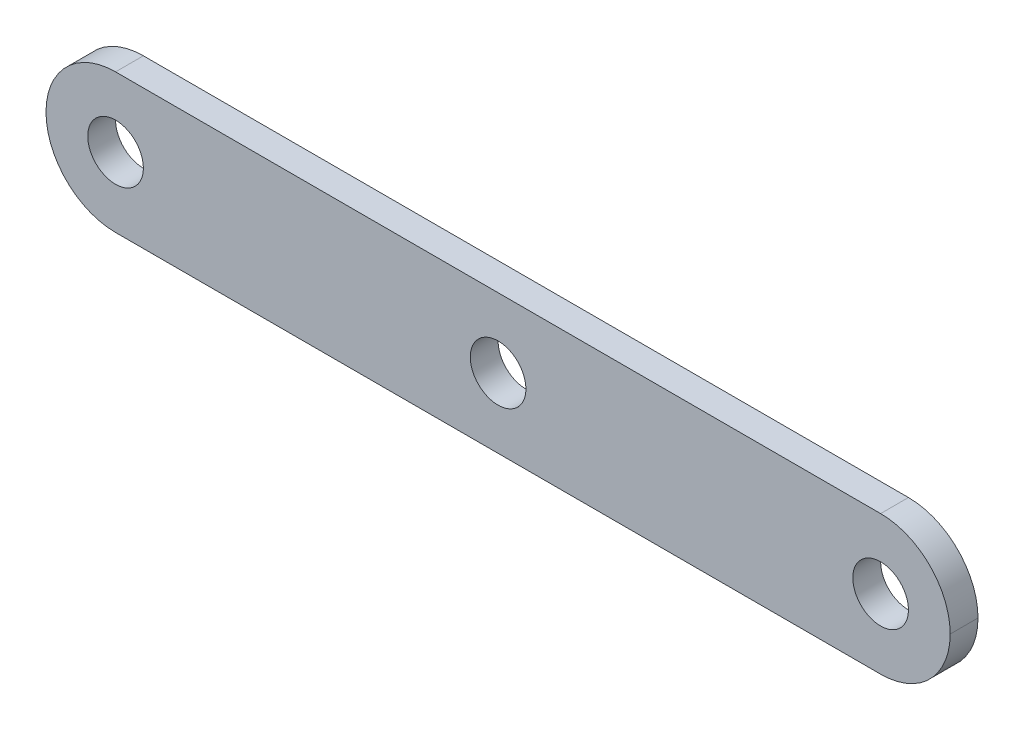
ISO-10303-21;
HEADER;
FILE_DESCRIPTION(('STEP AP214'),'2;1');
FILE_NAME('part.step','',(''),(''),'','','');
FILE_SCHEMA(('AUTOMOTIVE_DESIGN { 1 0 10303 214 1 1 1 1 }'));
ENDSEC;
DATA;
#1=APPLICATION_CONTEXT('core data for automotive mechanical design processes');
#2=APPLICATION_PROTOCOL_DEFINITION('international standard','automotive_design',2000,#1);
#3=PRODUCT_CONTEXT('',#1,'mechanical');
#4=PRODUCT('Part','Part','',(#3));
#5=PRODUCT_RELATED_PRODUCT_CATEGORY('part','',(#4));
#6=PRODUCT_DEFINITION_FORMATION('','',#4);
#7=PRODUCT_DEFINITION_CONTEXT('part definition',#1,'design');
#8=PRODUCT_DEFINITION('design','',#6,#7);
#9=PRODUCT_DEFINITION_SHAPE('','',#8);
#10=(LENGTH_UNIT() NAMED_UNIT(*) SI_UNIT(.MILLI.,.METRE.));
#11=(NAMED_UNIT(*) PLANE_ANGLE_UNIT() SI_UNIT($,.RADIAN.));
#12=(NAMED_UNIT(*) SI_UNIT($,.STERADIAN.) SOLID_ANGLE_UNIT());
#13=UNCERTAINTY_MEASURE_WITH_UNIT(LENGTH_MEASURE(1.E-05),#10,'distance_accuracy_value','');
#14=(GEOMETRIC_REPRESENTATION_CONTEXT(3) GLOBAL_UNCERTAINTY_ASSIGNED_CONTEXT((#13)) GLOBAL_UNIT_ASSIGNED_CONTEXT((#10,
#11,#12)) REPRESENTATION_CONTEXT('',''));
#15=CARTESIAN_POINT('',(0.,0.,0.));
#16=DIRECTION('',(0.,0.,1.));
#17=DIRECTION('',(1.,0.,0.));
#18=AXIS2_PLACEMENT_3D('',#15,#16,#17);
#19=CARTESIAN_POINT('',(-32.5,5.,2.));
#20=DIRECTION('',(0.,-1.,0.));
#21=DIRECTION('',(0.,0.,-1.));
#22=AXIS2_PLACEMENT_3D('',#19,#20,#21);
#23=PLANE('',#22);
#24=DIRECTION('',(-1.,0.,0.));
#25=VECTOR('',#24,1.);
#26=CARTESIAN_POINT('',(-32.5,5.,0.));
#27=LINE('',#26,#25);
#28=CARTESIAN_POINT('',(27.5,5.,0.));
#29=VERTEX_POINT('',#28);
#30=CARTESIAN_POINT('',(-27.5,5.,0.));
#31=VERTEX_POINT('',#30);
#32=EDGE_CURVE('E96',#29,#31,#27,.T.);
#33=ORIENTED_EDGE('',*,*,#32,.T.);
#34=DIRECTION('',(0.,0.,-1.));
#35=VECTOR('',#34,1.);
#36=CARTESIAN_POINT('',(-27.5,5.,2.));
#37=LINE('',#36,#35);
#38=CARTESIAN_POINT('',(-27.5,5.,2.));
#39=VERTEX_POINT('',#38);
#40=EDGE_CURVE('E11',#31,#39,#37,.F.);
#41=ORIENTED_EDGE('',*,*,#40,.T.);
#42=DIRECTION('',(-1.,0.,0.));
#43=VECTOR('',#42,1.);
#44=CARTESIAN_POINT('',(-32.5,5.,2.));
#45=LINE('',#44,#43);
#46=CARTESIAN_POINT('',(27.5,5.,2.));
#47=VERTEX_POINT('',#46);
#48=EDGE_CURVE('E128',#47,#39,#45,.T.);
#49=ORIENTED_EDGE('',*,*,#48,.F.);
#50=DIRECTION('',(0.,0.,-1.));
#51=VECTOR('',#50,1.);
#52=CARTESIAN_POINT('',(27.5,5.,2.));
#53=LINE('',#52,#51);
#54=EDGE_CURVE('E43',#47,#29,#53,.T.);
#55=ORIENTED_EDGE('',*,*,#54,.T.);
#56=EDGE_LOOP('',(#33,#41,#49,#55));
#57=FACE_BOUND('',#56,.T.);
#58=ADVANCED_FACE('F34',(#57),#23,.F.);
#59=CARTESIAN_POINT('',(-32.5,-5.,2.));
#60=DIRECTION('',(0.,1.,0.));
#61=DIRECTION('',(0.,0.,1.));
#62=AXIS2_PLACEMENT_3D('',#59,#60,#61);
#63=PLANE('',#62);
#64=DIRECTION('',(1.,0.,0.));
#65=VECTOR('',#64,1.);
#66=CARTESIAN_POINT('',(-32.5,-5.,0.));
#67=LINE('',#66,#65);
#68=CARTESIAN_POINT('',(-27.5,-5.,0.));
#69=VERTEX_POINT('',#68);
#70=CARTESIAN_POINT('',(27.5,-5.,0.));
#71=VERTEX_POINT('',#70);
#72=EDGE_CURVE('E129',#69,#71,#67,.T.);
#73=ORIENTED_EDGE('',*,*,#72,.T.);
#74=DIRECTION('',(0.,0.,-1.));
#75=VECTOR('',#74,1.);
#76=CARTESIAN_POINT('',(27.5,-5.,2.));
#77=LINE('',#76,#75);
#78=CARTESIAN_POINT('',(27.5,-5.,2.));
#79=VERTEX_POINT('',#78);
#80=EDGE_CURVE('E110',#71,#79,#77,.F.);
#81=ORIENTED_EDGE('',*,*,#80,.T.);
#82=DIRECTION('',(1.,0.,0.));
#83=VECTOR('',#82,1.);
#84=CARTESIAN_POINT('',(-32.5,-5.,2.));
#85=LINE('',#84,#83);
#86=CARTESIAN_POINT('',(-27.5,-5.,2.));
#87=VERTEX_POINT('',#86);
#88=EDGE_CURVE('E99',#87,#79,#85,.T.);
#89=ORIENTED_EDGE('',*,*,#88,.F.);
#90=DIRECTION('',(0.,0.,-1.));
#91=VECTOR('',#90,1.);
#92=CARTESIAN_POINT('',(-27.5,-5.,2.));
#93=LINE('',#92,#91);
#94=EDGE_CURVE('E118',#87,#69,#93,.T.);
#95=ORIENTED_EDGE('',*,*,#94,.T.);
#96=EDGE_LOOP('',(#73,#81,#89,#95));
#97=FACE_BOUND('',#96,.T.);
#98=ADVANCED_FACE('F166',(#97),#63,.F.);
#99=CARTESIAN_POINT('',(0.,0.,2.));
#100=DIRECTION('',(0.,0.,-1.));
#101=DIRECTION('',(-1.,0.,0.));
#102=AXIS2_PLACEMENT_3D('',#99,#100,#101);
#103=PLANE('',#102);
#104=CARTESIAN_POINT('',(27.5,0.,2.));
#105=DIRECTION('',(0.,0.,1.));
#106=DIRECTION('',(-1.,0.,0.));
#107=AXIS2_PLACEMENT_3D('',#104,#105,#106);
#108=CIRCLE('',#107,2.);
#109=CARTESIAN_POINT('',(25.5,0.,2.));
#110=VERTEX_POINT('',#109);
#111=EDGE_CURVE('E148',#110,#110,#108,.T.);
#112=ORIENTED_EDGE('',*,*,#111,.F.);
#113=EDGE_LOOP('',(#112));
#114=FACE_BOUND('',#113,.T.);
#115=CARTESIAN_POINT('',(0.,0.,2.));
#116=DIRECTION('',(0.,0.,1.));
#117=DIRECTION('',(1.,0.,0.));
#118=AXIS2_PLACEMENT_3D('',#115,#116,#117);
#119=CIRCLE('',#118,2.);
#120=CARTESIAN_POINT('',(2.,0.,2.));
#121=VERTEX_POINT('',#120);
#122=EDGE_CURVE('E142',#121,#121,#119,.T.);
#123=ORIENTED_EDGE('',*,*,#122,.F.);
#124=EDGE_LOOP('',(#123));
#125=FACE_BOUND('',#124,.T.);
#126=CARTESIAN_POINT('',(-27.5,0.,2.));
#127=DIRECTION('',(0.,0.,1.));
#128=DIRECTION('',(1.,0.,0.));
#129=AXIS2_PLACEMENT_3D('',#126,#127,#128);
#130=CIRCLE('',#129,2.);
#131=CARTESIAN_POINT('',(-25.5,0.,2.));
#132=VERTEX_POINT('',#131);
#133=EDGE_CURVE('E134',#132,#132,#130,.T.);
#134=ORIENTED_EDGE('',*,*,#133,.F.);
#135=EDGE_LOOP('',(#134));
#136=FACE_BOUND('',#135,.T.);
#137=CARTESIAN_POINT('',(-27.5,0.,2.));
#138=DIRECTION('',(0.,0.,-1.));
#139=DIRECTION('',(-1.,0.,0.));
#140=AXIS2_PLACEMENT_3D('',#137,#138,#139);
#141=CIRCLE('',#140,5.);
#142=CARTESIAN_POINT('',(-32.5,0.,2.));
#143=VERTEX_POINT('',#142);
#144=EDGE_CURVE('E51',#39,#143,#141,.F.);
#145=ORIENTED_EDGE('',*,*,#144,.T.);
#146=CARTESIAN_POINT('',(-27.5,0.,2.));
#147=DIRECTION('',(0.,0.,-1.));
#148=DIRECTION('',(-1.,0.,0.));
#149=AXIS2_PLACEMENT_3D('',#146,#147,#148);
#150=CIRCLE('',#149,5.);
#151=EDGE_CURVE('E126',#143,#87,#150,.F.);
#152=ORIENTED_EDGE('',*,*,#151,.T.);
#153=ORIENTED_EDGE('',*,*,#88,.T.);
#154=CARTESIAN_POINT('',(27.5,0.,2.));
#155=DIRECTION('',(0.,0.,-1.));
#156=DIRECTION('',(-1.,0.,0.));
#157=AXIS2_PLACEMENT_3D('',#154,#155,#156);
#158=CIRCLE('',#157,5.);
#159=CARTESIAN_POINT('',(32.5,0.,2.));
#160=VERTEX_POINT('',#159);
#161=EDGE_CURVE('E123',#79,#160,#158,.F.);
#162=ORIENTED_EDGE('',*,*,#161,.T.);
#163=CARTESIAN_POINT('',(27.5,0.,2.));
#164=DIRECTION('',(0.,0.,-1.));
#165=DIRECTION('',(-1.,0.,0.));
#166=AXIS2_PLACEMENT_3D('',#163,#164,#165);
#167=CIRCLE('',#166,5.);
#168=EDGE_CURVE('E105',#160,#47,#167,.F.);
#169=ORIENTED_EDGE('',*,*,#168,.T.);
#170=ORIENTED_EDGE('',*,*,#48,.T.);
#171=EDGE_LOOP('',(#145,#152,#153,#162,#169,#170));
#172=FACE_BOUND('',#171,.T.);
#173=ADVANCED_FACE('F163',(#114,#125,#136,#172),#103,.F.);
#174=CARTESIAN_POINT('',(0.,0.,0.));
#175=DIRECTION('',(0.,0.,-1.));
#176=DIRECTION('',(-1.,0.,0.));
#177=AXIS2_PLACEMENT_3D('',#174,#175,#176);
#178=PLANE('',#177);
#179=CARTESIAN_POINT('',(27.5,0.,0.));
#180=DIRECTION('',(0.,0.,1.));
#181=DIRECTION('',(-1.,0.,0.));
#182=AXIS2_PLACEMENT_3D('',#179,#180,#181);
#183=CIRCLE('',#182,2.);
#184=CARTESIAN_POINT('',(25.5,0.,0.));
#185=VERTEX_POINT('',#184);
#186=EDGE_CURVE('E139',#185,#185,#183,.T.);
#187=ORIENTED_EDGE('',*,*,#186,.T.);
#188=EDGE_LOOP('',(#187));
#189=FACE_BOUND('',#188,.T.);
#190=CARTESIAN_POINT('',(0.,0.,0.));
#191=DIRECTION('',(0.,0.,1.));
#192=DIRECTION('',(1.,0.,0.));
#193=AXIS2_PLACEMENT_3D('',#190,#191,#192);
#194=CIRCLE('',#193,2.);
#195=CARTESIAN_POINT('',(2.,0.,0.));
#196=VERTEX_POINT('',#195);
#197=EDGE_CURVE('E145',#196,#196,#194,.T.);
#198=ORIENTED_EDGE('',*,*,#197,.T.);
#199=EDGE_LOOP('',(#198));
#200=FACE_BOUND('',#199,.T.);
#201=CARTESIAN_POINT('',(-27.5,0.,0.));
#202=DIRECTION('',(0.,0.,1.));
#203=DIRECTION('',(1.,0.,0.));
#204=AXIS2_PLACEMENT_3D('',#201,#202,#203);
#205=CIRCLE('',#204,2.);
#206=CARTESIAN_POINT('',(-25.5,0.,0.));
#207=VERTEX_POINT('',#206);
#208=EDGE_CURVE('E138',#207,#207,#205,.T.);
#209=ORIENTED_EDGE('',*,*,#208,.T.);
#210=EDGE_LOOP('',(#209));
#211=FACE_BOUND('',#210,.T.);
#212=ORIENTED_EDGE('',*,*,#72,.F.);
#213=CARTESIAN_POINT('',(-27.5,0.,0.));
#214=DIRECTION('',(0.,0.,-1.));
#215=DIRECTION('',(-1.,0.,0.));
#216=AXIS2_PLACEMENT_3D('',#213,#214,#215);
#217=CIRCLE('',#216,5.);
#218=CARTESIAN_POINT('',(-32.5,0.,0.));
#219=VERTEX_POINT('',#218);
#220=EDGE_CURVE('E113',#69,#219,#217,.T.);
#221=ORIENTED_EDGE('',*,*,#220,.T.);
#222=CARTESIAN_POINT('',(-27.5,0.,0.));
#223=DIRECTION('',(0.,0.,-1.));
#224=DIRECTION('',(-1.,0.,0.));
#225=AXIS2_PLACEMENT_3D('',#222,#223,#224);
#226=CIRCLE('',#225,5.);
#227=EDGE_CURVE('E111',#219,#31,#226,.T.);
#228=ORIENTED_EDGE('',*,*,#227,.T.);
#229=ORIENTED_EDGE('',*,*,#32,.F.);
#230=CARTESIAN_POINT('',(27.5,0.,0.));
#231=DIRECTION('',(0.,0.,-1.));
#232=DIRECTION('',(-1.,0.,0.));
#233=AXIS2_PLACEMENT_3D('',#230,#231,#232);
#234=CIRCLE('',#233,5.);
#235=CARTESIAN_POINT('',(32.5,0.,0.));
#236=VERTEX_POINT('',#235);
#237=EDGE_CURVE('E89',#29,#236,#234,.T.);
#238=ORIENTED_EDGE('',*,*,#237,.T.);
#239=CARTESIAN_POINT('',(27.5,0.,0.));
#240=DIRECTION('',(0.,0.,-1.));
#241=DIRECTION('',(-1.,0.,0.));
#242=AXIS2_PLACEMENT_3D('',#239,#240,#241);
#243=CIRCLE('',#242,5.);
#244=EDGE_CURVE('E94',#236,#71,#243,.T.);
#245=ORIENTED_EDGE('',*,*,#244,.T.);
#246=EDGE_LOOP('',(#212,#221,#228,#229,#238,#245));
#247=FACE_BOUND('',#246,.T.);
#248=ADVANCED_FACE('F92',(#189,#200,#211,#247),#178,.T.);
#249=CARTESIAN_POINT('',(27.5,0.,2.));
#250=DIRECTION('',(0.,0.,-1.));
#251=DIRECTION('',(-1.,0.,0.));
#252=AXIS2_PLACEMENT_3D('',#249,#250,#251);
#253=CYLINDRICAL_SURFACE('',#252,5.);
#254=ORIENTED_EDGE('',*,*,#54,.F.);
#255=ORIENTED_EDGE('',*,*,#168,.F.);
#256=DIRECTION('',(0.,0.,-1.));
#257=VECTOR('',#256,1.);
#258=CARTESIAN_POINT('',(32.5,0.,2.));
#259=LINE('',#258,#257);
#260=EDGE_CURVE('E103',#236,#160,#259,.F.);
#261=ORIENTED_EDGE('',*,*,#260,.F.);
#262=ORIENTED_EDGE('',*,*,#237,.F.);
#263=EDGE_LOOP('',(#254,#255,#261,#262));
#264=FACE_BOUND('',#263,.T.);
#265=ADVANCED_FACE('F104',(#264),#253,.T.);
#266=CARTESIAN_POINT('',(27.5,0.,2.));
#267=DIRECTION('',(0.,0.,-1.));
#268=DIRECTION('',(-1.,0.,0.));
#269=AXIS2_PLACEMENT_3D('',#266,#267,#268);
#270=CYLINDRICAL_SURFACE('',#269,5.);
#271=ORIENTED_EDGE('',*,*,#161,.F.);
#272=ORIENTED_EDGE('',*,*,#80,.F.);
#273=ORIENTED_EDGE('',*,*,#244,.F.);
#274=ORIENTED_EDGE('',*,*,#260,.T.);
#275=EDGE_LOOP('',(#271,#272,#273,#274));
#276=FACE_BOUND('',#275,.T.);
#277=ADVANCED_FACE('F108',(#276),#270,.T.);
#278=CARTESIAN_POINT('',(-27.5,0.,2.));
#279=DIRECTION('',(0.,0.,-1.));
#280=DIRECTION('',(-1.,0.,0.));
#281=AXIS2_PLACEMENT_3D('',#278,#279,#280);
#282=CYLINDRICAL_SURFACE('',#281,5.);
#283=DIRECTION('',(0.,0.,-1.));
#284=VECTOR('',#283,1.);
#285=CARTESIAN_POINT('',(-32.5,0.,2.));
#286=LINE('',#285,#284);
#287=EDGE_CURVE('E38',#143,#219,#286,.T.);
#288=ORIENTED_EDGE('',*,*,#287,.F.);
#289=ORIENTED_EDGE('',*,*,#144,.F.);
#290=ORIENTED_EDGE('',*,*,#40,.F.);
#291=ORIENTED_EDGE('',*,*,#227,.F.);
#292=EDGE_LOOP('',(#288,#289,#290,#291));
#293=FACE_BOUND('',#292,.T.);
#294=ADVANCED_FACE('F36',(#293),#282,.T.);
#295=CARTESIAN_POINT('',(-27.5,0.,2.));
#296=DIRECTION('',(0.,0.,-1.));
#297=DIRECTION('',(-1.,0.,0.));
#298=AXIS2_PLACEMENT_3D('',#295,#296,#297);
#299=CYLINDRICAL_SURFACE('',#298,5.);
#300=ORIENTED_EDGE('',*,*,#151,.F.);
#301=ORIENTED_EDGE('',*,*,#287,.T.);
#302=ORIENTED_EDGE('',*,*,#220,.F.);
#303=ORIENTED_EDGE('',*,*,#94,.F.);
#304=EDGE_LOOP('',(#300,#301,#302,#303));
#305=FACE_BOUND('',#304,.T.);
#306=ADVANCED_FACE('F174',(#305),#299,.T.);
#307=CARTESIAN_POINT('',(-27.5,0.,0.));
#308=DIRECTION('',(0.,0.,1.));
#309=DIRECTION('',(1.,0.,0.));
#310=AXIS2_PLACEMENT_3D('',#307,#308,#309);
#311=CYLINDRICAL_SURFACE('',#310,2.);
#312=ORIENTED_EDGE('',*,*,#208,.F.);
#313=EDGE_LOOP('',(#312));
#314=FACE_BOUND('',#313,.T.);
#315=ORIENTED_EDGE('',*,*,#133,.T.);
#316=EDGE_LOOP('',(#315));
#317=FACE_BOUND('',#316,.T.);
#318=ADVANCED_FACE('F172',(#314,#317),#311,.F.);
#319=CARTESIAN_POINT('',(0.,0.,0.));
#320=DIRECTION('',(0.,0.,1.));
#321=DIRECTION('',(1.,0.,0.));
#322=AXIS2_PLACEMENT_3D('',#319,#320,#321);
#323=CYLINDRICAL_SURFACE('',#322,2.);
#324=ORIENTED_EDGE('',*,*,#197,.F.);
#325=EDGE_LOOP('',(#324));
#326=FACE_BOUND('',#325,.T.);
#327=ORIENTED_EDGE('',*,*,#122,.T.);
#328=EDGE_LOOP('',(#327));
#329=FACE_BOUND('',#328,.T.);
#330=ADVANCED_FACE('F159',(#326,#329),#323,.F.);
#331=CARTESIAN_POINT('',(27.5,0.,0.));
#332=DIRECTION('',(0.,0.,1.));
#333=DIRECTION('',(1.,0.,0.));
#334=AXIS2_PLACEMENT_3D('',#331,#332,#333);
#335=CYLINDRICAL_SURFACE('',#334,2.);
#336=ORIENTED_EDGE('',*,*,#186,.F.);
#337=EDGE_LOOP('',(#336));
#338=FACE_BOUND('',#337,.T.);
#339=ORIENTED_EDGE('',*,*,#111,.T.);
#340=EDGE_LOOP('',(#339));
#341=FACE_BOUND('',#340,.T.);
#342=ADVANCED_FACE('F156',(#338,#341),#335,.F.);
#343=CLOSED_SHELL('',(#58,#98,#173,#248,#265,#277,#294,#306,#318,#330,#342));
#344=MANIFOLD_SOLID_BREP('B2',#343);
#345=ADVANCED_BREP_SHAPE_REPRESENTATION('',(#18,#344),#14);
#346=SHAPE_DEFINITION_REPRESENTATION(#9,#345);
ENDSEC;
END-ISO-10303-21;
